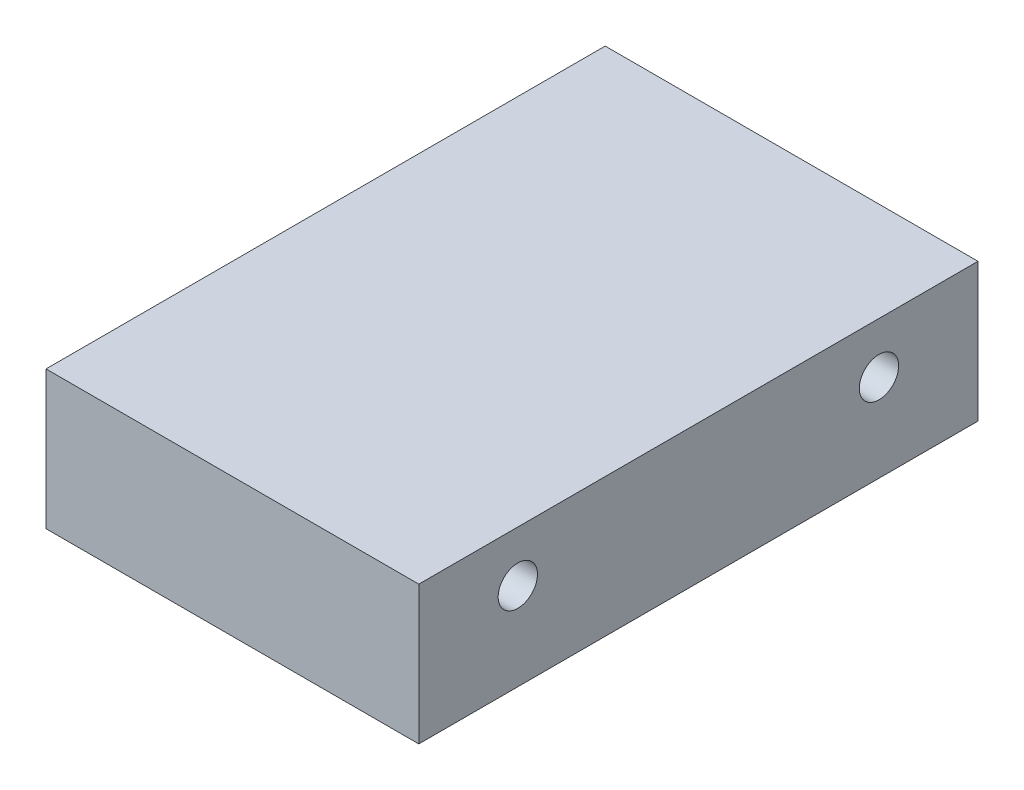
ISO-10303-21;
HEADER;
FILE_DESCRIPTION(('STEP AP214'),'2;1');
FILE_NAME('part.step','',(''),(''),'','','');
FILE_SCHEMA(('AUTOMOTIVE_DESIGN { 1 0 10303 214 1 1 1 1 }'));
ENDSEC;
DATA;
#1=APPLICATION_CONTEXT('core data for automotive mechanical design processes');
#2=APPLICATION_PROTOCOL_DEFINITION('international standard','automotive_design',2000,#1);
#3=PRODUCT_CONTEXT('',#1,'mechanical');
#4=PRODUCT('Part','Part','',(#3));
#5=PRODUCT_RELATED_PRODUCT_CATEGORY('part','',(#4));
#6=PRODUCT_DEFINITION_FORMATION('','',#4);
#7=PRODUCT_DEFINITION_CONTEXT('part definition',#1,'design');
#8=PRODUCT_DEFINITION('design','',#6,#7);
#9=PRODUCT_DEFINITION_SHAPE('','',#8);
#10=(LENGTH_UNIT() NAMED_UNIT(*) SI_UNIT(.MILLI.,.METRE.));
#11=(NAMED_UNIT(*) PLANE_ANGLE_UNIT() SI_UNIT($,.RADIAN.));
#12=(NAMED_UNIT(*) SI_UNIT($,.STERADIAN.) SOLID_ANGLE_UNIT());
#13=UNCERTAINTY_MEASURE_WITH_UNIT(LENGTH_MEASURE(1.E-05),#10,'distance_accuracy_value','');
#14=(GEOMETRIC_REPRESENTATION_CONTEXT(3) GLOBAL_UNCERTAINTY_ASSIGNED_CONTEXT((#13)) GLOBAL_UNIT_ASSIGNED_CONTEXT((#10,
#11,#12)) REPRESENTATION_CONTEXT('',''));
#15=CARTESIAN_POINT('',(0.,0.,0.));
#16=DIRECTION('',(0.,0.,1.));
#17=DIRECTION('',(1.,0.,0.));
#18=AXIS2_PLACEMENT_3D('',#15,#16,#17);
#19=CARTESIAN_POINT('',(-50.8,37.719,76.2));
#20=DIRECTION('',(1.,0.,0.));
#21=DIRECTION('',(0.,0.,-1.));
#22=AXIS2_PLACEMENT_3D('',#19,#20,#21);
#23=PLANE('',#22);
#24=CARTESIAN_POINT('',(-50.8,23.876,49.2125));
#25=DIRECTION('',(1.,0.,0.));
#26=DIRECTION('',(0.,0.,-1.));
#27=AXIS2_PLACEMENT_3D('',#24,#25,#26);
#28=CIRCLE('',#27,5.35813000000001);
#29=CARTESIAN_POINT('',(-50.8,23.876,43.85437));
#30=VERTEX_POINT('',#29);
#31=EDGE_CURVE('E100',#30,#30,#28,.T.);
#32=ORIENTED_EDGE('',*,*,#31,.T.);
#33=EDGE_LOOP('',(#32));
#34=FACE_BOUND('',#33,.T.);
#35=CARTESIAN_POINT('',(-50.8,23.876,-49.2125));
#36=DIRECTION('',(1.,0.,0.));
#37=DIRECTION('',(0.,0.,-1.));
#38=AXIS2_PLACEMENT_3D('',#35,#36,#37);
#39=CIRCLE('',#38,5.35813000000001);
#40=CARTESIAN_POINT('',(-50.8,23.876,-54.57063));
#41=VERTEX_POINT('',#40);
#42=EDGE_CURVE('E114',#41,#41,#39,.T.);
#43=ORIENTED_EDGE('',*,*,#42,.T.);
#44=EDGE_LOOP('',(#43));
#45=FACE_BOUND('',#44,.T.);
#46=DIRECTION('',(0.,0.,1.));
#47=VECTOR('',#46,1.);
#48=CARTESIAN_POINT('',(-50.8,0.,76.2));
#49=LINE('',#48,#47);
#50=CARTESIAN_POINT('',(-50.8,0.,-76.2));
#51=VERTEX_POINT('',#50);
#52=CARTESIAN_POINT('',(-50.8,0.,76.2));
#53=VERTEX_POINT('',#52);
#54=EDGE_CURVE('E97',#51,#53,#49,.T.);
#55=ORIENTED_EDGE('',*,*,#54,.T.);
#56=DIRECTION('',(0.,-1.,0.));
#57=VECTOR('',#56,1.);
#58=CARTESIAN_POINT('',(-50.8,37.719,76.2));
#59=LINE('',#58,#57);
#60=CARTESIAN_POINT('',(-50.8,37.719,76.2));
#61=VERTEX_POINT('',#60);
#62=EDGE_CURVE('E11',#61,#53,#59,.T.);
#63=ORIENTED_EDGE('',*,*,#62,.F.);
#64=DIRECTION('',(0.,0.,1.));
#65=VECTOR('',#64,1.);
#66=CARTESIAN_POINT('',(-50.8,37.719,76.2));
#67=LINE('',#66,#65);
#68=CARTESIAN_POINT('',(-50.8,37.719,-76.2));
#69=VERTEX_POINT('',#68);
#70=EDGE_CURVE('E85',#69,#61,#67,.T.);
#71=ORIENTED_EDGE('',*,*,#70,.F.);
#72=DIRECTION('',(0.,-1.,0.));
#73=VECTOR('',#72,1.);
#74=CARTESIAN_POINT('',(-50.8,37.719,-76.2));
#75=LINE('',#74,#73);
#76=EDGE_CURVE('E93',#69,#51,#75,.T.);
#77=ORIENTED_EDGE('',*,*,#76,.T.);
#78=EDGE_LOOP('',(#55,#63,#71,#77));
#79=FACE_BOUND('',#78,.T.);
#80=ADVANCED_FACE('F34',(#34,#45,#79),#23,.F.);
#81=CARTESIAN_POINT('',(50.8,37.719,76.2));
#82=DIRECTION('',(0.,0.,-1.));
#83=DIRECTION('',(-1.,0.,0.));
#84=AXIS2_PLACEMENT_3D('',#81,#82,#83);
#85=PLANE('',#84);
#86=DIRECTION('',(1.,0.,0.));
#87=VECTOR('',#86,1.);
#88=CARTESIAN_POINT('',(50.8,0.,76.2));
#89=LINE('',#88,#87);
#90=CARTESIAN_POINT('',(50.8,0.,76.2));
#91=VERTEX_POINT('',#90);
#92=EDGE_CURVE('E89',#53,#91,#89,.T.);
#93=ORIENTED_EDGE('',*,*,#92,.T.);
#94=DIRECTION('',(0.,-1.,0.));
#95=VECTOR('',#94,1.);
#96=CARTESIAN_POINT('',(50.8,37.719,76.2));
#97=LINE('',#96,#95);
#98=CARTESIAN_POINT('',(50.8,37.719,76.2));
#99=VERTEX_POINT('',#98);
#100=EDGE_CURVE('E42',#99,#91,#97,.T.);
#101=ORIENTED_EDGE('',*,*,#100,.F.);
#102=DIRECTION('',(1.,0.,0.));
#103=VECTOR('',#102,1.);
#104=CARTESIAN_POINT('',(50.8,37.719,76.2));
#105=LINE('',#104,#103);
#106=EDGE_CURVE('E80',#61,#99,#105,.T.);
#107=ORIENTED_EDGE('',*,*,#106,.F.);
#108=ORIENTED_EDGE('',*,*,#62,.T.);
#109=EDGE_LOOP('',(#93,#101,#107,#108));
#110=FACE_BOUND('',#109,.T.);
#111=ADVANCED_FACE('F88',(#110),#85,.F.);
#112=CARTESIAN_POINT('',(50.8,37.719,76.2));
#113=DIRECTION('',(-1.,0.,0.));
#114=DIRECTION('',(0.,0.,1.));
#115=AXIS2_PLACEMENT_3D('',#112,#113,#114);
#116=PLANE('',#115);
#117=CARTESIAN_POINT('',(50.8,23.876,49.2125));
#118=DIRECTION('',(1.,0.,0.));
#119=DIRECTION('',(0.,0.,-1.));
#120=AXIS2_PLACEMENT_3D('',#117,#118,#119);
#121=CIRCLE('',#120,5.35813000000001);
#122=CARTESIAN_POINT('',(50.8,23.876,43.85437));
#123=VERTEX_POINT('',#122);
#124=EDGE_CURVE('E117',#123,#123,#121,.T.);
#125=ORIENTED_EDGE('',*,*,#124,.F.);
#126=EDGE_LOOP('',(#125));
#127=FACE_BOUND('',#126,.T.);
#128=CARTESIAN_POINT('',(50.8,23.876,-49.2125));
#129=DIRECTION('',(1.,0.,0.));
#130=DIRECTION('',(0.,0.,-1.));
#131=AXIS2_PLACEMENT_3D('',#128,#129,#130);
#132=CIRCLE('',#131,5.35813000000001);
#133=CARTESIAN_POINT('',(50.8,23.876,-54.57063));
#134=VERTEX_POINT('',#133);
#135=EDGE_CURVE('E111',#134,#134,#132,.T.);
#136=ORIENTED_EDGE('',*,*,#135,.F.);
#137=EDGE_LOOP('',(#136));
#138=FACE_BOUND('',#137,.T.);
#139=DIRECTION('',(0.,0.,-1.));
#140=VECTOR('',#139,1.);
#141=CARTESIAN_POINT('',(50.8,0.,76.2));
#142=LINE('',#141,#140);
#143=CARTESIAN_POINT('',(50.8,0.,-76.2));
#144=VERTEX_POINT('',#143);
#145=EDGE_CURVE('E67',#91,#144,#142,.T.);
#146=ORIENTED_EDGE('',*,*,#145,.T.);
#147=DIRECTION('',(0.,-1.,0.));
#148=VECTOR('',#147,1.);
#149=CARTESIAN_POINT('',(50.8,37.719,-76.2));
#150=LINE('',#149,#148);
#151=CARTESIAN_POINT('',(50.8,37.719,-76.2));
#152=VERTEX_POINT('',#151);
#153=EDGE_CURVE('E90',#152,#144,#150,.T.);
#154=ORIENTED_EDGE('',*,*,#153,.F.);
#155=DIRECTION('',(0.,0.,-1.));
#156=VECTOR('',#155,1.);
#157=CARTESIAN_POINT('',(50.8,37.719,76.2));
#158=LINE('',#157,#156);
#159=EDGE_CURVE('E83',#99,#152,#158,.T.);
#160=ORIENTED_EDGE('',*,*,#159,.F.);
#161=ORIENTED_EDGE('',*,*,#100,.T.);
#162=EDGE_LOOP('',(#146,#154,#160,#161));
#163=FACE_BOUND('',#162,.T.);
#164=ADVANCED_FACE('F91',(#127,#138,#163),#116,.F.);
#165=CARTESIAN_POINT('',(50.8,37.719,-76.2));
#166=DIRECTION('',(0.,0.,1.));
#167=DIRECTION('',(1.,0.,0.));
#168=AXIS2_PLACEMENT_3D('',#165,#166,#167);
#169=PLANE('',#168);
#170=DIRECTION('',(-1.,0.,0.));
#171=VECTOR('',#170,1.);
#172=CARTESIAN_POINT('',(50.8,0.,-76.2));
#173=LINE('',#172,#171);
#174=EDGE_CURVE('E73',#144,#51,#173,.T.);
#175=ORIENTED_EDGE('',*,*,#174,.T.);
#176=ORIENTED_EDGE('',*,*,#76,.F.);
#177=DIRECTION('',(-1.,0.,0.));
#178=VECTOR('',#177,1.);
#179=CARTESIAN_POINT('',(50.8,37.719,-76.2));
#180=LINE('',#179,#178);
#181=EDGE_CURVE('E50',#152,#69,#180,.T.);
#182=ORIENTED_EDGE('',*,*,#181,.F.);
#183=ORIENTED_EDGE('',*,*,#153,.T.);
#184=EDGE_LOOP('',(#175,#176,#182,#183));
#185=FACE_BOUND('',#184,.T.);
#186=ADVANCED_FACE('F105',(#185),#169,.F.);
#187=CARTESIAN_POINT('',(0.,37.719,0.));
#188=DIRECTION('',(0.,1.,0.));
#189=DIRECTION('',(0.,0.,1.));
#190=AXIS2_PLACEMENT_3D('',#187,#188,#189);
#191=PLANE('',#190);
#192=ORIENTED_EDGE('',*,*,#70,.T.);
#193=ORIENTED_EDGE('',*,*,#106,.T.);
#194=ORIENTED_EDGE('',*,*,#159,.T.);
#195=ORIENTED_EDGE('',*,*,#181,.T.);
#196=EDGE_LOOP('',(#192,#193,#194,#195));
#197=FACE_BOUND('',#196,.T.);
#198=ADVANCED_FACE('F81',(#197),#191,.T.);
#199=CARTESIAN_POINT('',(0.,0.,0.));
#200=DIRECTION('',(0.,1.,0.));
#201=DIRECTION('',(0.,0.,1.));
#202=AXIS2_PLACEMENT_3D('',#199,#200,#201);
#203=PLANE('',#202);
#204=ORIENTED_EDGE('',*,*,#54,.F.);
#205=ORIENTED_EDGE('',*,*,#174,.F.);
#206=ORIENTED_EDGE('',*,*,#145,.F.);
#207=ORIENTED_EDGE('',*,*,#92,.F.);
#208=EDGE_LOOP('',(#204,#205,#206,#207));
#209=FACE_BOUND('',#208,.T.);
#210=ADVANCED_FACE('F108',(#209),#203,.F.);
#211=CARTESIAN_POINT('',(-50.8,23.876,-49.2125));
#212=DIRECTION('',(1.,0.,0.));
#213=DIRECTION('',(0.,0.,-1.));
#214=AXIS2_PLACEMENT_3D('',#211,#212,#213);
#215=CYLINDRICAL_SURFACE('',#214,5.35813000000001);
#216=ORIENTED_EDGE('',*,*,#42,.F.);
#217=EDGE_LOOP('',(#216));
#218=FACE_BOUND('',#217,.T.);
#219=ORIENTED_EDGE('',*,*,#135,.T.);
#220=EDGE_LOOP('',(#219));
#221=FACE_BOUND('',#220,.T.);
#222=ADVANCED_FACE('F128',(#218,#221),#215,.F.);
#223=CARTESIAN_POINT('',(-50.8,23.876,49.2125));
#224=DIRECTION('',(1.,0.,0.));
#225=DIRECTION('',(0.,0.,-1.));
#226=AXIS2_PLACEMENT_3D('',#223,#224,#225);
#227=CYLINDRICAL_SURFACE('',#226,5.35813000000001);
#228=ORIENTED_EDGE('',*,*,#31,.F.);
#229=EDGE_LOOP('',(#228));
#230=FACE_BOUND('',#229,.T.);
#231=ORIENTED_EDGE('',*,*,#124,.T.);
#232=EDGE_LOOP('',(#231));
#233=FACE_BOUND('',#232,.T.);
#234=ADVANCED_FACE('F125',(#230,#233),#227,.F.);
#235=CLOSED_SHELL('',(#80,#111,#164,#186,#198,#210,#222,#234));
#236=MANIFOLD_SOLID_BREP('B2',#235);
#237=ADVANCED_BREP_SHAPE_REPRESENTATION('',(#18,#236),#14);
#238=SHAPE_DEFINITION_REPRESENTATION(#9,#237);
ENDSEC;
END-ISO-10303-21;
